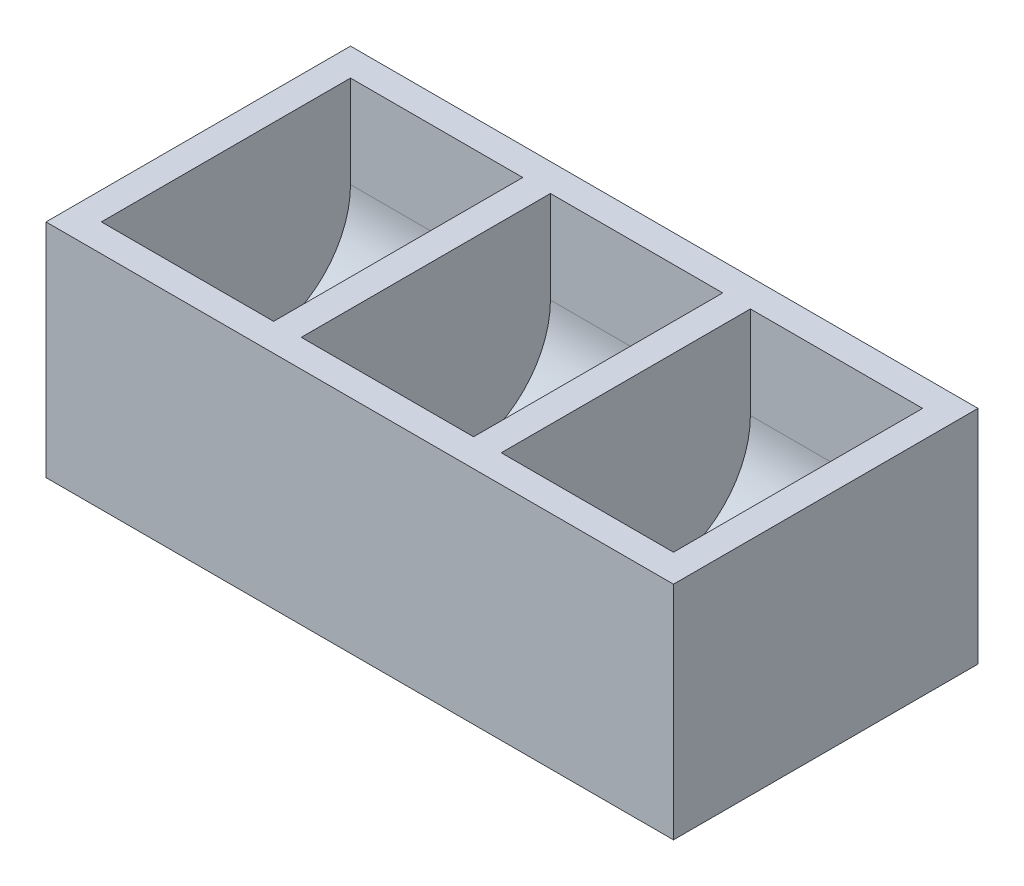
ISO-10303-21;
HEADER;
FILE_DESCRIPTION(('STEP AP214'),'2;1');
FILE_NAME('part.step','',(''),(''),'','','');
FILE_SCHEMA(('AUTOMOTIVE_DESIGN { 1 0 10303 214 1 1 1 1 }'));
ENDSEC;
DATA;
#1=APPLICATION_CONTEXT('core data for automotive mechanical design processes');
#2=APPLICATION_PROTOCOL_DEFINITION('international standard','automotive_design',2000,#1);
#3=PRODUCT_CONTEXT('',#1,'mechanical');
#4=PRODUCT('Part','Part','',(#3));
#5=PRODUCT_RELATED_PRODUCT_CATEGORY('part','',(#4));
#6=PRODUCT_DEFINITION_FORMATION('','',#4);
#7=PRODUCT_DEFINITION_CONTEXT('part definition',#1,'design');
#8=PRODUCT_DEFINITION('design','',#6,#7);
#9=PRODUCT_DEFINITION_SHAPE('','',#8);
#10=(LENGTH_UNIT() NAMED_UNIT(*) SI_UNIT(.MILLI.,.METRE.));
#11=(NAMED_UNIT(*) PLANE_ANGLE_UNIT() SI_UNIT($,.RADIAN.));
#12=(NAMED_UNIT(*) SI_UNIT($,.STERADIAN.) SOLID_ANGLE_UNIT());
#13=UNCERTAINTY_MEASURE_WITH_UNIT(LENGTH_MEASURE(1.E-05),#10,'distance_accuracy_value','');
#14=(GEOMETRIC_REPRESENTATION_CONTEXT(3) GLOBAL_UNCERTAINTY_ASSIGNED_CONTEXT((#13)) GLOBAL_UNIT_ASSIGNED_CONTEXT((#10,
#11,#12)) REPRESENTATION_CONTEXT('',''));
#15=CARTESIAN_POINT('',(0.,0.,0.));
#16=DIRECTION('',(0.,0.,1.));
#17=DIRECTION('',(1.,0.,0.));
#18=AXIS2_PLACEMENT_3D('',#15,#16,#17);
#19=CARTESIAN_POINT('',(68.,48.,33.));
#20=DIRECTION('',(-1.,0.,0.));
#21=DIRECTION('',(0.,0.,1.));
#22=AXIS2_PLACEMENT_3D('',#19,#20,#21);
#23=PLANE('',#22);
#24=DIRECTION('',(0.,0.,-1.));
#25=VECTOR('',#24,1.);
#26=CARTESIAN_POINT('',(68.,0.,33.));
#27=LINE('',#26,#25);
#28=CARTESIAN_POINT('',(68.,0.,33.));
#29=VERTEX_POINT('',#28);
#30=CARTESIAN_POINT('',(68.,0.,-33.));
#31=VERTEX_POINT('',#30);
#32=EDGE_CURVE('E318',#29,#31,#27,.T.);
#33=ORIENTED_EDGE('',*,*,#32,.T.);
#34=DIRECTION('',(0.,-1.,0.));
#35=VECTOR('',#34,1.);
#36=CARTESIAN_POINT('',(68.,48.,-33.));
#37=LINE('',#36,#35);
#38=CARTESIAN_POINT('',(68.,48.,-33.));
#39=VERTEX_POINT('',#38);
#40=EDGE_CURVE('E207',#39,#31,#37,.T.);
#41=ORIENTED_EDGE('',*,*,#40,.F.);
#42=DIRECTION('',(0.,0.,-1.));
#43=VECTOR('',#42,1.);
#44=CARTESIAN_POINT('',(68.,48.,33.));
#45=LINE('',#44,#43);
#46=CARTESIAN_POINT('',(68.,48.,33.));
#47=VERTEX_POINT('',#46);
#48=EDGE_CURVE('E341',#47,#39,#45,.T.);
#49=ORIENTED_EDGE('',*,*,#48,.F.);
#50=DIRECTION('',(0.,-1.,0.));
#51=VECTOR('',#50,1.);
#52=CARTESIAN_POINT('',(68.,48.,33.));
#53=LINE('',#52,#51);
#54=EDGE_CURVE('E351',#47,#29,#53,.T.);
#55=ORIENTED_EDGE('',*,*,#54,.T.);
#56=EDGE_LOOP('',(#33,#41,#49,#55));
#57=FACE_BOUND('',#56,.T.);
#58=ADVANCED_FACE('F34',(#57),#23,.F.);
#59=CARTESIAN_POINT('',(-68.,48.,-33.));
#60=DIRECTION('',(0.,0.,1.));
#61=DIRECTION('',(1.,0.,0.));
#62=AXIS2_PLACEMENT_3D('',#59,#60,#61);
#63=PLANE('',#62);
#64=DIRECTION('',(-1.,0.,0.));
#65=VECTOR('',#64,1.);
#66=CARTESIAN_POINT('',(-68.,0.,-33.));
#67=LINE('',#66,#65);
#68=CARTESIAN_POINT('',(-68.,0.,-33.));
#69=VERTEX_POINT('',#68);
#70=EDGE_CURVE('E354',#31,#69,#67,.T.);
#71=ORIENTED_EDGE('',*,*,#70,.T.);
#72=DIRECTION('',(0.,-1.,0.));
#73=VECTOR('',#72,1.);
#74=CARTESIAN_POINT('',(-68.,48.,-33.));
#75=LINE('',#74,#73);
#76=CARTESIAN_POINT('',(-68.,48.,-33.));
#77=VERTEX_POINT('',#76);
#78=EDGE_CURVE('E364',#77,#69,#75,.T.);
#79=ORIENTED_EDGE('',*,*,#78,.F.);
#80=DIRECTION('',(-1.,0.,0.));
#81=VECTOR('',#80,1.);
#82=CARTESIAN_POINT('',(-68.,48.,-33.));
#83=LINE('',#82,#81);
#84=EDGE_CURVE('E344',#39,#77,#83,.T.);
#85=ORIENTED_EDGE('',*,*,#84,.F.);
#86=ORIENTED_EDGE('',*,*,#40,.T.);
#87=EDGE_LOOP('',(#71,#79,#85,#86));
#88=FACE_BOUND('',#87,.T.);
#89=ADVANCED_FACE('F395',(#88),#63,.F.);
#90=CARTESIAN_POINT('',(-68.,48.,33.));
#91=DIRECTION('',(1.,0.,0.));
#92=DIRECTION('',(0.,0.,-1.));
#93=AXIS2_PLACEMENT_3D('',#90,#91,#92);
#94=PLANE('',#93);
#95=DIRECTION('',(0.,0.,1.));
#96=VECTOR('',#95,1.);
#97=CARTESIAN_POINT('',(-68.,0.,33.));
#98=LINE('',#97,#96);
#99=CARTESIAN_POINT('',(-68.,0.,33.));
#100=VERTEX_POINT('',#99);
#101=EDGE_CURVE('E356',#69,#100,#98,.T.);
#102=ORIENTED_EDGE('',*,*,#101,.T.);
#103=DIRECTION('',(0.,-1.,0.));
#104=VECTOR('',#103,1.);
#105=CARTESIAN_POINT('',(-68.,48.,33.));
#106=LINE('',#105,#104);
#107=CARTESIAN_POINT('',(-68.,48.,33.));
#108=VERTEX_POINT('',#107);
#109=EDGE_CURVE('E361',#108,#100,#106,.T.);
#110=ORIENTED_EDGE('',*,*,#109,.F.);
#111=DIRECTION('',(0.,0.,1.));
#112=VECTOR('',#111,1.);
#113=CARTESIAN_POINT('',(-68.,48.,33.));
#114=LINE('',#113,#112);
#115=EDGE_CURVE('E347',#77,#108,#114,.T.);
#116=ORIENTED_EDGE('',*,*,#115,.F.);
#117=ORIENTED_EDGE('',*,*,#78,.T.);
#118=EDGE_LOOP('',(#102,#110,#116,#117));
#119=FACE_BOUND('',#118,.T.);
#120=ADVANCED_FACE('F400',(#119),#94,.F.);
#121=CARTESIAN_POINT('',(-68.,48.,33.));
#122=DIRECTION('',(0.,0.,-1.));
#123=DIRECTION('',(-1.,0.,0.));
#124=AXIS2_PLACEMENT_3D('',#121,#122,#123);
#125=PLANE('',#124);
#126=DIRECTION('',(1.,0.,0.));
#127=VECTOR('',#126,1.);
#128=CARTESIAN_POINT('',(-68.,0.,33.));
#129=LINE('',#128,#127);
#130=EDGE_CURVE('E345',#100,#29,#129,.T.);
#131=ORIENTED_EDGE('',*,*,#130,.T.);
#132=ORIENTED_EDGE('',*,*,#54,.F.);
#133=DIRECTION('',(1.,0.,0.));
#134=VECTOR('',#133,1.);
#135=CARTESIAN_POINT('',(-68.,48.,33.));
#136=LINE('',#135,#134);
#137=EDGE_CURVE('E349',#108,#47,#136,.T.);
#138=ORIENTED_EDGE('',*,*,#137,.F.);
#139=ORIENTED_EDGE('',*,*,#109,.T.);
#140=EDGE_LOOP('',(#131,#132,#138,#139));
#141=FACE_BOUND('',#140,.T.);
#142=ADVANCED_FACE('F406',(#141),#125,.F.);
#143=CARTESIAN_POINT('',(0.,48.,0.));
#144=DIRECTION('',(0.,-1.,0.));
#145=DIRECTION('',(0.,0.,-1.));
#146=AXIS2_PLACEMENT_3D('',#143,#144,#145);
#147=PLANE('',#146);
#148=DIRECTION('',(0.,0.,-1.));
#149=VECTOR('',#148,1.);
#150=CARTESIAN_POINT('',(-62.,48.,0.));
#151=LINE('',#150,#149);
#152=CARTESIAN_POINT('',(-62.,48.,27.));
#153=VERTEX_POINT('',#152);
#154=CARTESIAN_POINT('',(-62.,48.,-27.));
#155=VERTEX_POINT('',#154);
#156=EDGE_CURVE('E235',#153,#155,#151,.T.);
#157=ORIENTED_EDGE('',*,*,#156,.T.);
#158=DIRECTION('',(1.,0.,0.));
#159=VECTOR('',#158,1.);
#160=CARTESIAN_POINT('',(0.,48.,-27.));
#161=LINE('',#160,#159);
#162=CARTESIAN_POINT('',(-24.67,48.,-27.));
#163=VERTEX_POINT('',#162);
#164=EDGE_CURVE('E238',#155,#163,#161,.T.);
#165=ORIENTED_EDGE('',*,*,#164,.T.);
#166=DIRECTION('',(0.,0.,1.));
#167=VECTOR('',#166,1.);
#168=CARTESIAN_POINT('',(-24.67,48.,0.));
#169=LINE('',#168,#167);
#170=CARTESIAN_POINT('',(-24.67,48.,27.));
#171=VERTEX_POINT('',#170);
#172=EDGE_CURVE('E229',#163,#171,#169,.T.);
#173=ORIENTED_EDGE('',*,*,#172,.T.);
#174=DIRECTION('',(-1.,0.,0.));
#175=VECTOR('',#174,1.);
#176=CARTESIAN_POINT('',(0.,48.,27.));
#177=LINE('',#176,#175);
#178=EDGE_CURVE('E232',#171,#153,#177,.T.);
#179=ORIENTED_EDGE('',*,*,#178,.T.);
#180=EDGE_LOOP('',(#157,#165,#173,#179));
#181=FACE_BOUND('',#180,.T.);
#182=DIRECTION('',(0.,0.,-1.));
#183=VECTOR('',#182,1.);
#184=CARTESIAN_POINT('',(-18.67,48.,0.));
#185=LINE('',#184,#183);
#186=CARTESIAN_POINT('',(-18.67,48.,27.));
#187=VERTEX_POINT('',#186);
#188=CARTESIAN_POINT('',(-18.67,48.,-27.));
#189=VERTEX_POINT('',#188);
#190=EDGE_CURVE('E223',#187,#189,#185,.T.);
#191=ORIENTED_EDGE('',*,*,#190,.T.);
#192=DIRECTION('',(1.,0.,0.));
#193=VECTOR('',#192,1.);
#194=CARTESIAN_POINT('',(0.,48.,-27.));
#195=LINE('',#194,#193);
#196=CARTESIAN_POINT('',(18.67,48.,-27.));
#197=VERTEX_POINT('',#196);
#198=EDGE_CURVE('E226',#189,#197,#195,.T.);
#199=ORIENTED_EDGE('',*,*,#198,.T.);
#200=DIRECTION('',(0.,0.,1.));
#201=VECTOR('',#200,1.);
#202=CARTESIAN_POINT('',(18.67,48.,0.));
#203=LINE('',#202,#201);
#204=CARTESIAN_POINT('',(18.67,48.,27.));
#205=VERTEX_POINT('',#204);
#206=EDGE_CURVE('E213',#197,#205,#203,.T.);
#207=ORIENTED_EDGE('',*,*,#206,.T.);
#208=DIRECTION('',(-1.,0.,0.));
#209=VECTOR('',#208,1.);
#210=CARTESIAN_POINT('',(0.,48.,27.));
#211=LINE('',#210,#209);
#212=EDGE_CURVE('E216',#205,#187,#211,.T.);
#213=ORIENTED_EDGE('',*,*,#212,.T.);
#214=EDGE_LOOP('',(#191,#199,#207,#213));
#215=FACE_BOUND('',#214,.T.);
#216=DIRECTION('',(0.,0.,-1.));
#217=VECTOR('',#216,1.);
#218=CARTESIAN_POINT('',(24.67,48.,0.));
#219=LINE('',#218,#217);
#220=CARTESIAN_POINT('',(24.67,48.,27.));
#221=VERTEX_POINT('',#220);
#222=CARTESIAN_POINT('',(24.67,48.,-27.));
#223=VERTEX_POINT('',#222);
#224=EDGE_CURVE('E212',#221,#223,#219,.T.);
#225=ORIENTED_EDGE('',*,*,#224,.T.);
#226=DIRECTION('',(1.,0.,0.));
#227=VECTOR('',#226,1.);
#228=CARTESIAN_POINT('',(0.,48.,-27.));
#229=LINE('',#228,#227);
#230=CARTESIAN_POINT('',(62.,48.,-27.));
#231=VERTEX_POINT('',#230);
#232=EDGE_CURVE('E188',#223,#231,#229,.T.);
#233=ORIENTED_EDGE('',*,*,#232,.T.);
#234=DIRECTION('',(0.,0.,1.));
#235=VECTOR('',#234,1.);
#236=CARTESIAN_POINT('',(62.,48.,0.));
#237=LINE('',#236,#235);
#238=CARTESIAN_POINT('',(62.,48.,27.));
#239=VERTEX_POINT('',#238);
#240=EDGE_CURVE('E198',#231,#239,#237,.T.);
#241=ORIENTED_EDGE('',*,*,#240,.T.);
#242=DIRECTION('',(-1.,0.,0.));
#243=VECTOR('',#242,1.);
#244=CARTESIAN_POINT('',(0.,48.,27.));
#245=LINE('',#244,#243);
#246=EDGE_CURVE('E206',#239,#221,#245,.T.);
#247=ORIENTED_EDGE('',*,*,#246,.T.);
#248=EDGE_LOOP('',(#225,#233,#241,#247));
#249=FACE_BOUND('',#248,.T.);
#250=ORIENTED_EDGE('',*,*,#48,.T.);
#251=ORIENTED_EDGE('',*,*,#84,.T.);
#252=ORIENTED_EDGE('',*,*,#115,.T.);
#253=ORIENTED_EDGE('',*,*,#137,.T.);
#254=EDGE_LOOP('',(#250,#251,#252,#253));
#255=FACE_BOUND('',#254,.T.);
#256=ADVANCED_FACE('F209',(#181,#215,#249,#255),#147,.F.);
#257=CARTESIAN_POINT('',(0.,0.,0.));
#258=DIRECTION('',(0.,-1.,0.));
#259=DIRECTION('',(0.,0.,-1.));
#260=AXIS2_PLACEMENT_3D('',#257,#258,#259);
#261=PLANE('',#260);
#262=ORIENTED_EDGE('',*,*,#32,.F.);
#263=ORIENTED_EDGE('',*,*,#130,.F.);
#264=ORIENTED_EDGE('',*,*,#101,.F.);
#265=ORIENTED_EDGE('',*,*,#70,.F.);
#266=EDGE_LOOP('',(#262,#263,#264,#265));
#267=FACE_BOUND('',#266,.T.);
#268=ADVANCED_FACE('F411',(#267),#261,.T.);
#269=CARTESIAN_POINT('',(24.67,-65.6526892061552,-27.));
#270=DIRECTION('',(0.,0.,-1.));
#271=DIRECTION('',(-1.,0.,0.));
#272=AXIS2_PLACEMENT_3D('',#269,#270,#271);
#273=PLANE('',#272);
#274=DIRECTION('',(0.,1.,0.));
#275=VECTOR('',#274,1.);
#276=CARTESIAN_POINT('',(24.67,-65.6526892061552,-27.));
#277=LINE('',#276,#275);
#278=CARTESIAN_POINT('',(24.67,28.,-27.));
#279=VERTEX_POINT('',#278);
#280=EDGE_CURVE('E337',#279,#223,#277,.T.);
#281=ORIENTED_EDGE('',*,*,#280,.F.);
#282=DIRECTION('',(-1.,0.,0.));
#283=VECTOR('',#282,1.);
#284=CARTESIAN_POINT('',(62.,28.,-27.));
#285=LINE('',#284,#283);
#286=CARTESIAN_POINT('',(62.,28.,-27.));
#287=VERTEX_POINT('',#286);
#288=EDGE_CURVE('E191',#279,#287,#285,.F.);
#289=ORIENTED_EDGE('',*,*,#288,.T.);
#290=DIRECTION('',(0.,1.,0.));
#291=VECTOR('',#290,1.);
#292=CARTESIAN_POINT('',(62.,-65.6526892061552,-27.));
#293=LINE('',#292,#291);
#294=EDGE_CURVE('E183',#287,#231,#293,.T.);
#295=ORIENTED_EDGE('',*,*,#294,.T.);
#296=ORIENTED_EDGE('',*,*,#232,.F.);
#297=EDGE_LOOP('',(#281,#289,#295,#296));
#298=FACE_BOUND('',#297,.T.);
#299=ADVANCED_FACE('F186',(#298),#273,.F.);
#300=CARTESIAN_POINT('',(24.67,-65.6526892061552,27.));
#301=DIRECTION('',(-1.,0.,0.));
#302=DIRECTION('',(0.,0.,1.));
#303=AXIS2_PLACEMENT_3D('',#300,#301,#302);
#304=PLANE('',#303);
#305=DIRECTION('',(0.,1.,0.));
#306=VECTOR('',#305,1.);
#307=CARTESIAN_POINT('',(24.67,-65.6526892061552,27.));
#308=LINE('',#307,#306);
#309=CARTESIAN_POINT('',(24.67,28.,27.));
#310=VERTEX_POINT('',#309);
#311=EDGE_CURVE('E336',#310,#221,#308,.T.);
#312=ORIENTED_EDGE('',*,*,#311,.F.);
#313=CARTESIAN_POINT('',(24.67,28.,7.));
#314=DIRECTION('',(-1.,0.,0.));
#315=DIRECTION('',(0.,0.,1.));
#316=AXIS2_PLACEMENT_3D('',#313,#314,#315);
#317=CIRCLE('',#316,20.);
#318=CARTESIAN_POINT('',(24.67,8.00000000000001,7.));
#319=VERTEX_POINT('',#318);
#320=EDGE_CURVE('E255',#310,#319,#317,.F.);
#321=ORIENTED_EDGE('',*,*,#320,.T.);
#322=DIRECTION('',(0.,0.,1.));
#323=VECTOR('',#322,1.);
#324=CARTESIAN_POINT('',(24.67,8.00000000000001,27.));
#325=LINE('',#324,#323);
#326=CARTESIAN_POINT('',(24.67,8.00000000000001,-7.));
#327=VERTEX_POINT('',#326);
#328=EDGE_CURVE('E333',#327,#319,#325,.T.);
#329=ORIENTED_EDGE('',*,*,#328,.F.);
#330=CARTESIAN_POINT('',(24.67,28.,-7.));
#331=DIRECTION('',(-1.,0.,0.));
#332=DIRECTION('',(0.,0.,1.));
#333=AXIS2_PLACEMENT_3D('',#330,#331,#332);
#334=CIRCLE('',#333,20.);
#335=EDGE_CURVE('E253',#327,#279,#334,.F.);
#336=ORIENTED_EDGE('',*,*,#335,.T.);
#337=ORIENTED_EDGE('',*,*,#280,.T.);
#338=ORIENTED_EDGE('',*,*,#224,.F.);
#339=EDGE_LOOP('',(#312,#321,#329,#336,#337,#338));
#340=FACE_BOUND('',#339,.T.);
#341=ADVANCED_FACE('F374',(#340),#304,.F.);
#342=CARTESIAN_POINT('',(24.67,-65.6526892061552,27.));
#343=DIRECTION('',(0.,0.,1.));
#344=DIRECTION('',(1.,0.,0.));
#345=AXIS2_PLACEMENT_3D('',#342,#343,#344);
#346=PLANE('',#345);
#347=DIRECTION('',(0.,1.,0.));
#348=VECTOR('',#347,1.);
#349=CARTESIAN_POINT('',(62.,-65.6526892061552,27.));
#350=LINE('',#349,#348);
#351=CARTESIAN_POINT('',(62.,28.,27.));
#352=VERTEX_POINT('',#351);
#353=EDGE_CURVE('E202',#352,#239,#350,.T.);
#354=ORIENTED_EDGE('',*,*,#353,.F.);
#355=DIRECTION('',(1.,0.,0.));
#356=VECTOR('',#355,1.);
#357=CARTESIAN_POINT('',(24.67,28.,27.));
#358=LINE('',#357,#356);
#359=EDGE_CURVE('E251',#352,#310,#358,.F.);
#360=ORIENTED_EDGE('',*,*,#359,.T.);
#361=ORIENTED_EDGE('',*,*,#311,.T.);
#362=ORIENTED_EDGE('',*,*,#246,.F.);
#363=EDGE_LOOP('',(#354,#360,#361,#362));
#364=FACE_BOUND('',#363,.T.);
#365=ADVANCED_FACE('F369',(#364),#346,.F.);
#366=CARTESIAN_POINT('',(62.,-65.6526892061552,27.));
#367=DIRECTION('',(1.,0.,0.));
#368=DIRECTION('',(0.,0.,-1.));
#369=AXIS2_PLACEMENT_3D('',#366,#367,#368);
#370=PLANE('',#369);
#371=DIRECTION('',(0.,0.,-1.));
#372=VECTOR('',#371,1.);
#373=CARTESIAN_POINT('',(62.,8.00000000000001,27.));
#374=LINE('',#373,#372);
#375=CARTESIAN_POINT('',(62.,8.00000000000001,7.));
#376=VERTEX_POINT('',#375);
#377=CARTESIAN_POINT('',(62.,8.00000000000001,-7.));
#378=VERTEX_POINT('',#377);
#379=EDGE_CURVE('E195',#376,#378,#374,.T.);
#380=ORIENTED_EDGE('',*,*,#379,.F.);
#381=CARTESIAN_POINT('',(62.,28.,7.));
#382=DIRECTION('',(1.,0.,0.));
#383=DIRECTION('',(0.,0.,-1.));
#384=AXIS2_PLACEMENT_3D('',#381,#382,#383);
#385=CIRCLE('',#384,20.);
#386=EDGE_CURVE('E249',#376,#352,#385,.F.);
#387=ORIENTED_EDGE('',*,*,#386,.T.);
#388=ORIENTED_EDGE('',*,*,#353,.T.);
#389=ORIENTED_EDGE('',*,*,#240,.F.);
#390=ORIENTED_EDGE('',*,*,#294,.F.);
#391=CARTESIAN_POINT('',(62.,28.,-7.));
#392=DIRECTION('',(1.,0.,0.));
#393=DIRECTION('',(0.,0.,-1.));
#394=AXIS2_PLACEMENT_3D('',#391,#392,#393);
#395=CIRCLE('',#394,20.);
#396=EDGE_CURVE('E247',#287,#378,#395,.F.);
#397=ORIENTED_EDGE('',*,*,#396,.T.);
#398=EDGE_LOOP('',(#380,#387,#388,#389,#390,#397));
#399=FACE_BOUND('',#398,.T.);
#400=ADVANCED_FACE('F200',(#399),#370,.F.);
#401=CARTESIAN_POINT('',(0.,8.,0.));
#402=DIRECTION('',(0.,-1.,0.));
#403=DIRECTION('',(0.,0.,-1.));
#404=AXIS2_PLACEMENT_3D('',#401,#402,#403);
#405=PLANE('',#404);
#406=ORIENTED_EDGE('',*,*,#328,.T.);
#407=DIRECTION('',(1.,0.,0.));
#408=VECTOR('',#407,1.);
#409=CARTESIAN_POINT('',(62.,8.,7.));
#410=LINE('',#409,#408);
#411=EDGE_CURVE('E244',#319,#376,#410,.T.);
#412=ORIENTED_EDGE('',*,*,#411,.T.);
#413=ORIENTED_EDGE('',*,*,#379,.T.);
#414=DIRECTION('',(-1.,0.,0.));
#415=VECTOR('',#414,1.);
#416=CARTESIAN_POINT('',(24.67,8.,-7.));
#417=LINE('',#416,#415);
#418=EDGE_CURVE('E241',#378,#327,#417,.T.);
#419=ORIENTED_EDGE('',*,*,#418,.T.);
#420=EDGE_LOOP('',(#406,#412,#413,#419));
#421=FACE_BOUND('',#420,.T.);
#422=ADVANCED_FACE('F380',(#421),#405,.F.);
#423=CARTESIAN_POINT('',(-18.67,-65.6526892061552,-27.));
#424=DIRECTION('',(0.,0.,-1.));
#425=DIRECTION('',(-1.,0.,0.));
#426=AXIS2_PLACEMENT_3D('',#423,#424,#425);
#427=PLANE('',#426);
#428=DIRECTION('',(0.,1.,0.));
#429=VECTOR('',#428,1.);
#430=CARTESIAN_POINT('',(-18.67,-65.6526892061552,-27.));
#431=LINE('',#430,#429);
#432=CARTESIAN_POINT('',(-18.67,28.,-27.));
#433=VERTEX_POINT('',#432);
#434=EDGE_CURVE('E194',#433,#189,#431,.T.);
#435=ORIENTED_EDGE('',*,*,#434,.F.);
#436=DIRECTION('',(-1.,0.,0.));
#437=VECTOR('',#436,1.);
#438=CARTESIAN_POINT('',(18.67,28.,-27.));
#439=LINE('',#438,#437);
#440=CARTESIAN_POINT('',(18.67,28.,-27.));
#441=VERTEX_POINT('',#440);
#442=EDGE_CURVE('E268',#433,#441,#439,.F.);
#443=ORIENTED_EDGE('',*,*,#442,.T.);
#444=DIRECTION('',(0.,1.,0.));
#445=VECTOR('',#444,1.);
#446=CARTESIAN_POINT('',(18.67,-65.6526892061552,-27.));
#447=LINE('',#446,#445);
#448=EDGE_CURVE('E316',#441,#197,#447,.T.);
#449=ORIENTED_EDGE('',*,*,#448,.T.);
#450=ORIENTED_EDGE('',*,*,#198,.F.);
#451=EDGE_LOOP('',(#435,#443,#449,#450));
#452=FACE_BOUND('',#451,.T.);
#453=ADVANCED_FACE('F420',(#452),#427,.F.);
#454=CARTESIAN_POINT('',(-18.67,-65.6526892061552,27.));
#455=DIRECTION('',(-1.,0.,0.));
#456=DIRECTION('',(0.,0.,1.));
#457=AXIS2_PLACEMENT_3D('',#454,#455,#456);
#458=PLANE('',#457);
#459=DIRECTION('',(0.,0.,1.));
#460=VECTOR('',#459,1.);
#461=CARTESIAN_POINT('',(-18.67,8.00000000000001,27.));
#462=LINE('',#461,#460);
#463=CARTESIAN_POINT('',(-18.67,8.00000000000001,-7.));
#464=VERTEX_POINT('',#463);
#465=CARTESIAN_POINT('',(-18.67,8.00000000000001,7.));
#466=VERTEX_POINT('',#465);
#467=EDGE_CURVE('E323',#464,#466,#462,.T.);
#468=ORIENTED_EDGE('',*,*,#467,.F.);
#469=CARTESIAN_POINT('',(-18.67,28.,-7.));
#470=DIRECTION('',(-1.,0.,0.));
#471=DIRECTION('',(0.,0.,1.));
#472=AXIS2_PLACEMENT_3D('',#469,#470,#471);
#473=CIRCLE('',#472,20.);
#474=EDGE_CURVE('E266',#464,#433,#473,.F.);
#475=ORIENTED_EDGE('',*,*,#474,.T.);
#476=ORIENTED_EDGE('',*,*,#434,.T.);
#477=ORIENTED_EDGE('',*,*,#190,.F.);
#478=DIRECTION('',(0.,1.,0.));
#479=VECTOR('',#478,1.);
#480=CARTESIAN_POINT('',(-18.67,-65.6526892061552,27.));
#481=LINE('',#480,#479);
#482=CARTESIAN_POINT('',(-18.67,28.,27.));
#483=VERTEX_POINT('',#482);
#484=EDGE_CURVE('E326',#483,#187,#481,.T.);
#485=ORIENTED_EDGE('',*,*,#484,.F.);
#486=CARTESIAN_POINT('',(-18.67,28.,7.));
#487=DIRECTION('',(-1.,0.,0.));
#488=DIRECTION('',(0.,0.,1.));
#489=AXIS2_PLACEMENT_3D('',#486,#487,#488);
#490=CIRCLE('',#489,20.);
#491=EDGE_CURVE('E264',#483,#466,#490,.F.);
#492=ORIENTED_EDGE('',*,*,#491,.T.);
#493=EDGE_LOOP('',(#468,#475,#476,#477,#485,#492));
#494=FACE_BOUND('',#493,.T.);
#495=ADVANCED_FACE('F437',(#494),#458,.F.);
#496=CARTESIAN_POINT('',(-18.67,-65.6526892061552,27.));
#497=DIRECTION('',(0.,0.,1.));
#498=DIRECTION('',(1.,0.,0.));
#499=AXIS2_PLACEMENT_3D('',#496,#497,#498);
#500=PLANE('',#499);
#501=DIRECTION('',(0.,1.,0.));
#502=VECTOR('',#501,1.);
#503=CARTESIAN_POINT('',(18.67,-65.6526892061552,27.));
#504=LINE('',#503,#502);
#505=CARTESIAN_POINT('',(18.67,28.,27.));
#506=VERTEX_POINT('',#505);
#507=EDGE_CURVE('E322',#506,#205,#504,.T.);
#508=ORIENTED_EDGE('',*,*,#507,.F.);
#509=DIRECTION('',(1.,0.,0.));
#510=VECTOR('',#509,1.);
#511=CARTESIAN_POINT('',(-18.67,28.,27.));
#512=LINE('',#511,#510);
#513=EDGE_CURVE('E274',#506,#483,#512,.F.);
#514=ORIENTED_EDGE('',*,*,#513,.T.);
#515=ORIENTED_EDGE('',*,*,#484,.T.);
#516=ORIENTED_EDGE('',*,*,#212,.F.);
#517=EDGE_LOOP('',(#508,#514,#515,#516));
#518=FACE_BOUND('',#517,.T.);
#519=ADVANCED_FACE('F441',(#518),#500,.F.);
#520=CARTESIAN_POINT('',(18.67,-65.6526892061552,27.));
#521=DIRECTION('',(1.,0.,0.));
#522=DIRECTION('',(0.,0.,-1.));
#523=AXIS2_PLACEMENT_3D('',#520,#521,#522);
#524=PLANE('',#523);
#525=ORIENTED_EDGE('',*,*,#448,.F.);
#526=CARTESIAN_POINT('',(18.67,28.,-7.));
#527=DIRECTION('',(1.,0.,0.));
#528=DIRECTION('',(0.,0.,-1.));
#529=AXIS2_PLACEMENT_3D('',#526,#527,#528);
#530=CIRCLE('',#529,20.);
#531=CARTESIAN_POINT('',(18.67,8.00000000000001,-7.));
#532=VERTEX_POINT('',#531);
#533=EDGE_CURVE('E272',#441,#532,#530,.F.);
#534=ORIENTED_EDGE('',*,*,#533,.T.);
#535=DIRECTION('',(0.,0.,-1.));
#536=VECTOR('',#535,1.);
#537=CARTESIAN_POINT('',(18.67,8.00000000000001,27.));
#538=LINE('',#537,#536);
#539=CARTESIAN_POINT('',(18.67,8.00000000000001,7.));
#540=VERTEX_POINT('',#539);
#541=EDGE_CURVE('E319',#540,#532,#538,.T.);
#542=ORIENTED_EDGE('',*,*,#541,.F.);
#543=CARTESIAN_POINT('',(18.67,28.,7.));
#544=DIRECTION('',(1.,0.,0.));
#545=DIRECTION('',(0.,0.,-1.));
#546=AXIS2_PLACEMENT_3D('',#543,#544,#545);
#547=CIRCLE('',#546,20.);
#548=EDGE_CURVE('E270',#540,#506,#547,.F.);
#549=ORIENTED_EDGE('',*,*,#548,.T.);
#550=ORIENTED_EDGE('',*,*,#507,.T.);
#551=ORIENTED_EDGE('',*,*,#206,.F.);
#552=EDGE_LOOP('',(#525,#534,#542,#549,#550,#551));
#553=FACE_BOUND('',#552,.T.);
#554=ADVANCED_FACE('F433',(#553),#524,.F.);
#555=CARTESIAN_POINT('',(0.,8.,0.));
#556=DIRECTION('',(0.,-1.,0.));
#557=DIRECTION('',(0.,0.,-1.));
#558=AXIS2_PLACEMENT_3D('',#555,#556,#557);
#559=PLANE('',#558);
#560=ORIENTED_EDGE('',*,*,#541,.T.);
#561=DIRECTION('',(-1.,0.,0.));
#562=VECTOR('',#561,1.);
#563=CARTESIAN_POINT('',(-18.67,8.,-7.));
#564=LINE('',#563,#562);
#565=EDGE_CURVE('E261',#532,#464,#564,.T.);
#566=ORIENTED_EDGE('',*,*,#565,.T.);
#567=ORIENTED_EDGE('',*,*,#467,.T.);
#568=DIRECTION('',(1.,0.,0.));
#569=VECTOR('',#568,1.);
#570=CARTESIAN_POINT('',(18.67,8.,7.));
#571=LINE('',#570,#569);
#572=EDGE_CURVE('E258',#466,#540,#571,.T.);
#573=ORIENTED_EDGE('',*,*,#572,.T.);
#574=EDGE_LOOP('',(#560,#566,#567,#573));
#575=FACE_BOUND('',#574,.T.);
#576=ADVANCED_FACE('F429',(#575),#559,.F.);
#577=CARTESIAN_POINT('',(-62.,-65.6526892061552,-27.));
#578=DIRECTION('',(0.,0.,-1.));
#579=DIRECTION('',(-1.,0.,0.));
#580=AXIS2_PLACEMENT_3D('',#577,#578,#579);
#581=PLANE('',#580);
#582=DIRECTION('',(0.,1.,0.));
#583=VECTOR('',#582,1.);
#584=CARTESIAN_POINT('',(-62.,-65.6526892061552,-27.));
#585=LINE('',#584,#583);
#586=CARTESIAN_POINT('',(-62.,28.,-27.));
#587=VERTEX_POINT('',#586);
#588=EDGE_CURVE('E300',#587,#155,#585,.T.);
#589=ORIENTED_EDGE('',*,*,#588,.F.);
#590=DIRECTION('',(-1.,0.,0.));
#591=VECTOR('',#590,1.);
#592=CARTESIAN_POINT('',(-24.67,28.,-27.));
#593=LINE('',#592,#591);
#594=CARTESIAN_POINT('',(-24.67,28.,-27.));
#595=VERTEX_POINT('',#594);
#596=EDGE_CURVE('E12',#587,#595,#593,.F.);
#597=ORIENTED_EDGE('',*,*,#596,.T.);
#598=DIRECTION('',(0.,1.,0.));
#599=VECTOR('',#598,1.);
#600=CARTESIAN_POINT('',(-24.67,-65.6526892061552,-27.));
#601=LINE('',#600,#599);
#602=EDGE_CURVE('E311',#595,#163,#601,.T.);
#603=ORIENTED_EDGE('',*,*,#602,.T.);
#604=ORIENTED_EDGE('',*,*,#164,.F.);
#605=EDGE_LOOP('',(#589,#597,#603,#604));
#606=FACE_BOUND('',#605,.T.);
#607=ADVANCED_FACE('F432',(#606),#581,.F.);
#608=CARTESIAN_POINT('',(-62.,-65.6526892061552,27.));
#609=DIRECTION('',(-1.,0.,0.));
#610=DIRECTION('',(0.,0.,1.));
#611=AXIS2_PLACEMENT_3D('',#608,#609,#610);
#612=PLANE('',#611);
#613=DIRECTION('',(0.,1.,0.));
#614=VECTOR('',#613,1.);
#615=CARTESIAN_POINT('',(-62.,-65.6526892061552,27.));
#616=LINE('',#615,#614);
#617=CARTESIAN_POINT('',(-62.,28.,27.));
#618=VERTEX_POINT('',#617);
#619=EDGE_CURVE('E292',#618,#153,#616,.T.);
#620=ORIENTED_EDGE('',*,*,#619,.F.);
#621=CARTESIAN_POINT('',(-62.,28.,7.));
#622=DIRECTION('',(-1.,0.,0.));
#623=DIRECTION('',(0.,0.,1.));
#624=AXIS2_PLACEMENT_3D('',#621,#622,#623);
#625=CIRCLE('',#624,20.);
#626=CARTESIAN_POINT('',(-62.,8.00000000000001,7.));
#627=VERTEX_POINT('',#626);
#628=EDGE_CURVE('E42',#618,#627,#625,.F.);
#629=ORIENTED_EDGE('',*,*,#628,.T.);
#630=DIRECTION('',(0.,0.,1.));
#631=VECTOR('',#630,1.);
#632=CARTESIAN_POINT('',(-62.,8.00000000000001,27.));
#633=LINE('',#632,#631);
#634=CARTESIAN_POINT('',(-62.,8.00000000000001,-7.));
#635=VERTEX_POINT('',#634);
#636=EDGE_CURVE('E290',#635,#627,#633,.T.);
#637=ORIENTED_EDGE('',*,*,#636,.F.);
#638=CARTESIAN_POINT('',(-62.,28.,-7.00000000000001));
#639=DIRECTION('',(-1.,0.,0.));
#640=DIRECTION('',(0.,0.,1.));
#641=AXIS2_PLACEMENT_3D('',#638,#639,#640);
#642=CIRCLE('',#641,20.);
#643=EDGE_CURVE('E49',#635,#587,#642,.F.);
#644=ORIENTED_EDGE('',*,*,#643,.T.);
#645=ORIENTED_EDGE('',*,*,#588,.T.);
#646=ORIENTED_EDGE('',*,*,#156,.F.);
#647=EDGE_LOOP('',(#620,#629,#637,#644,#645,#646));
#648=FACE_BOUND('',#647,.T.);
#649=ADVANCED_FACE('F289',(#648),#612,.F.);
#650=CARTESIAN_POINT('',(-62.,-65.6526892061552,27.));
#651=DIRECTION('',(0.,0.,1.));
#652=DIRECTION('',(1.,0.,0.));
#653=AXIS2_PLACEMENT_3D('',#650,#651,#652);
#654=PLANE('',#653);
#655=DIRECTION('',(0.,1.,0.));
#656=VECTOR('',#655,1.);
#657=CARTESIAN_POINT('',(-24.67,-65.6526892061552,27.));
#658=LINE('',#657,#656);
#659=CARTESIAN_POINT('',(-24.67,28.,27.));
#660=VERTEX_POINT('',#659);
#661=EDGE_CURVE('E306',#660,#171,#658,.T.);
#662=ORIENTED_EDGE('',*,*,#661,.F.);
#663=DIRECTION('',(1.,0.,0.));
#664=VECTOR('',#663,1.);
#665=CARTESIAN_POINT('',(-62.,28.,27.));
#666=LINE('',#665,#664);
#667=EDGE_CURVE('E57',#660,#618,#666,.F.);
#668=ORIENTED_EDGE('',*,*,#667,.T.);
#669=ORIENTED_EDGE('',*,*,#619,.T.);
#670=ORIENTED_EDGE('',*,*,#178,.F.);
#671=EDGE_LOOP('',(#662,#668,#669,#670));
#672=FACE_BOUND('',#671,.T.);
#673=ADVANCED_FACE('F309',(#672),#654,.F.);
#674=CARTESIAN_POINT('',(-24.67,-65.6526892061552,27.));
#675=DIRECTION('',(1.,0.,0.));
#676=DIRECTION('',(0.,0.,-1.));
#677=AXIS2_PLACEMENT_3D('',#674,#675,#676);
#678=PLANE('',#677);
#679=DIRECTION('',(0.,0.,-1.));
#680=VECTOR('',#679,1.);
#681=CARTESIAN_POINT('',(-24.67,8.00000000000001,27.));
#682=LINE('',#681,#680);
#683=CARTESIAN_POINT('',(-24.67,8.00000000000001,7.));
#684=VERTEX_POINT('',#683);
#685=CARTESIAN_POINT('',(-24.67,8.00000000000001,-7.00000000000001));
#686=VERTEX_POINT('',#685);
#687=EDGE_CURVE('E308',#684,#686,#682,.T.);
#688=ORIENTED_EDGE('',*,*,#687,.F.);
#689=CARTESIAN_POINT('',(-24.67,28.,7.));
#690=DIRECTION('',(1.,0.,0.));
#691=DIRECTION('',(0.,0.,-1.));
#692=AXIS2_PLACEMENT_3D('',#689,#690,#691);
#693=CIRCLE('',#692,20.);
#694=EDGE_CURVE('E284',#684,#660,#693,.F.);
#695=ORIENTED_EDGE('',*,*,#694,.T.);
#696=ORIENTED_EDGE('',*,*,#661,.T.);
#697=ORIENTED_EDGE('',*,*,#172,.F.);
#698=ORIENTED_EDGE('',*,*,#602,.F.);
#699=CARTESIAN_POINT('',(-24.67,28.,-7.00000000000002));
#700=DIRECTION('',(1.,0.,0.));
#701=DIRECTION('',(0.,0.,-1.));
#702=AXIS2_PLACEMENT_3D('',#699,#700,#701);
#703=CIRCLE('',#702,20.);
#704=EDGE_CURVE('E282',#595,#686,#703,.F.);
#705=ORIENTED_EDGE('',*,*,#704,.T.);
#706=EDGE_LOOP('',(#688,#695,#696,#697,#698,#705));
#707=FACE_BOUND('',#706,.T.);
#708=ADVANCED_FACE('F304',(#707),#678,.F.);
#709=CARTESIAN_POINT('',(0.,8.,0.));
#710=DIRECTION('',(0.,-1.,0.));
#711=DIRECTION('',(0.,0.,-1.));
#712=AXIS2_PLACEMENT_3D('',#709,#710,#711);
#713=PLANE('',#712);
#714=ORIENTED_EDGE('',*,*,#636,.T.);
#715=DIRECTION('',(1.,0.,0.));
#716=VECTOR('',#715,1.);
#717=CARTESIAN_POINT('',(-24.67,8.,7.));
#718=LINE('',#717,#716);
#719=EDGE_CURVE('E279',#627,#684,#718,.T.);
#720=ORIENTED_EDGE('',*,*,#719,.T.);
#721=ORIENTED_EDGE('',*,*,#687,.T.);
#722=DIRECTION('',(-1.,0.,0.));
#723=VECTOR('',#722,1.);
#724=CARTESIAN_POINT('',(-62.,8.,-7.00000000000001));
#725=LINE('',#724,#723);
#726=EDGE_CURVE('E276',#686,#635,#725,.T.);
#727=ORIENTED_EDGE('',*,*,#726,.T.);
#728=EDGE_LOOP('',(#714,#720,#721,#727));
#729=FACE_BOUND('',#728,.T.);
#730=ADVANCED_FACE('F296',(#729),#713,.F.);
#731=CARTESIAN_POINT('',(0.,28.,7.));
#732=DIRECTION('',(-1.,0.,0.));
#733=DIRECTION('',(0.,0.,1.));
#734=AXIS2_PLACEMENT_3D('',#731,#732,#733);
#735=CYLINDRICAL_SURFACE('',#734,20.);
#736=ORIENTED_EDGE('',*,*,#320,.F.);
#737=ORIENTED_EDGE('',*,*,#359,.F.);
#738=ORIENTED_EDGE('',*,*,#386,.F.);
#739=ORIENTED_EDGE('',*,*,#411,.F.);
#740=EDGE_LOOP('',(#736,#737,#738,#739));
#741=FACE_BOUND('',#740,.T.);
#742=ADVANCED_FACE('F383',(#741),#735,.F.);
#743=CARTESIAN_POINT('',(0.,28.,-7.));
#744=DIRECTION('',(1.,0.,0.));
#745=DIRECTION('',(0.,0.,-1.));
#746=AXIS2_PLACEMENT_3D('',#743,#744,#745);
#747=CYLINDRICAL_SURFACE('',#746,20.);
#748=ORIENTED_EDGE('',*,*,#396,.F.);
#749=ORIENTED_EDGE('',*,*,#288,.F.);
#750=ORIENTED_EDGE('',*,*,#335,.F.);
#751=ORIENTED_EDGE('',*,*,#418,.F.);
#752=EDGE_LOOP('',(#748,#749,#750,#751));
#753=FACE_BOUND('',#752,.T.);
#754=ADVANCED_FACE('F377',(#753),#747,.F.);
#755=CARTESIAN_POINT('',(0.,28.,-7.));
#756=DIRECTION('',(1.,0.,0.));
#757=DIRECTION('',(0.,0.,-1.));
#758=AXIS2_PLACEMENT_3D('',#755,#756,#757);
#759=CYLINDRICAL_SURFACE('',#758,20.);
#760=ORIENTED_EDGE('',*,*,#533,.F.);
#761=ORIENTED_EDGE('',*,*,#442,.F.);
#762=ORIENTED_EDGE('',*,*,#474,.F.);
#763=ORIENTED_EDGE('',*,*,#565,.F.);
#764=EDGE_LOOP('',(#760,#761,#762,#763));
#765=FACE_BOUND('',#764,.T.);
#766=ADVANCED_FACE('F390',(#765),#759,.F.);
#767=CARTESIAN_POINT('',(0.,28.,7.));
#768=DIRECTION('',(-1.,0.,0.));
#769=DIRECTION('',(0.,0.,1.));
#770=AXIS2_PLACEMENT_3D('',#767,#768,#769);
#771=CYLINDRICAL_SURFACE('',#770,20.);
#772=ORIENTED_EDGE('',*,*,#491,.F.);
#773=ORIENTED_EDGE('',*,*,#513,.F.);
#774=ORIENTED_EDGE('',*,*,#548,.F.);
#775=ORIENTED_EDGE('',*,*,#572,.F.);
#776=EDGE_LOOP('',(#772,#773,#774,#775));
#777=FACE_BOUND('',#776,.T.);
#778=ADVANCED_FACE('F484',(#777),#771,.F.);
#779=CARTESIAN_POINT('',(0.,28.,7.00000000000001));
#780=DIRECTION('',(-1.,0.,0.));
#781=DIRECTION('',(0.,0.,1.));
#782=AXIS2_PLACEMENT_3D('',#779,#780,#781);
#783=CYLINDRICAL_SURFACE('',#782,20.);
#784=ORIENTED_EDGE('',*,*,#628,.F.);
#785=ORIENTED_EDGE('',*,*,#667,.F.);
#786=ORIENTED_EDGE('',*,*,#694,.F.);
#787=ORIENTED_EDGE('',*,*,#719,.F.);
#788=EDGE_LOOP('',(#784,#785,#786,#787));
#789=FACE_BOUND('',#788,.T.);
#790=ADVANCED_FACE('F302',(#789),#783,.F.);
#791=CARTESIAN_POINT('',(0.,28.,-7.00000000000002));
#792=DIRECTION('',(1.,0.,0.));
#793=DIRECTION('',(0.,0.,-1.));
#794=AXIS2_PLACEMENT_3D('',#791,#792,#793);
#795=CYLINDRICAL_SURFACE('',#794,20.);
#796=ORIENTED_EDGE('',*,*,#704,.F.);
#797=ORIENTED_EDGE('',*,*,#596,.F.);
#798=ORIENTED_EDGE('',*,*,#643,.F.);
#799=ORIENTED_EDGE('',*,*,#726,.F.);
#800=EDGE_LOOP('',(#796,#797,#798,#799));
#801=FACE_BOUND('',#800,.T.);
#802=ADVANCED_FACE('F36',(#801),#795,.F.);
#803=CLOSED_SHELL('',(#58,#89,#120,#142,#256,#268,#299,#341,#365,#400,#422,#453,#495,#519,#554,
#576,#607,#649,#673,#708,#730,#742,#754,#766,#778,#790,#802));
#804=MANIFOLD_SOLID_BREP('B2',#803);
#805=ADVANCED_BREP_SHAPE_REPRESENTATION('',(#18,#804),#14);
#806=SHAPE_DEFINITION_REPRESENTATION(#9,#805);
ENDSEC;
END-ISO-10303-21;
